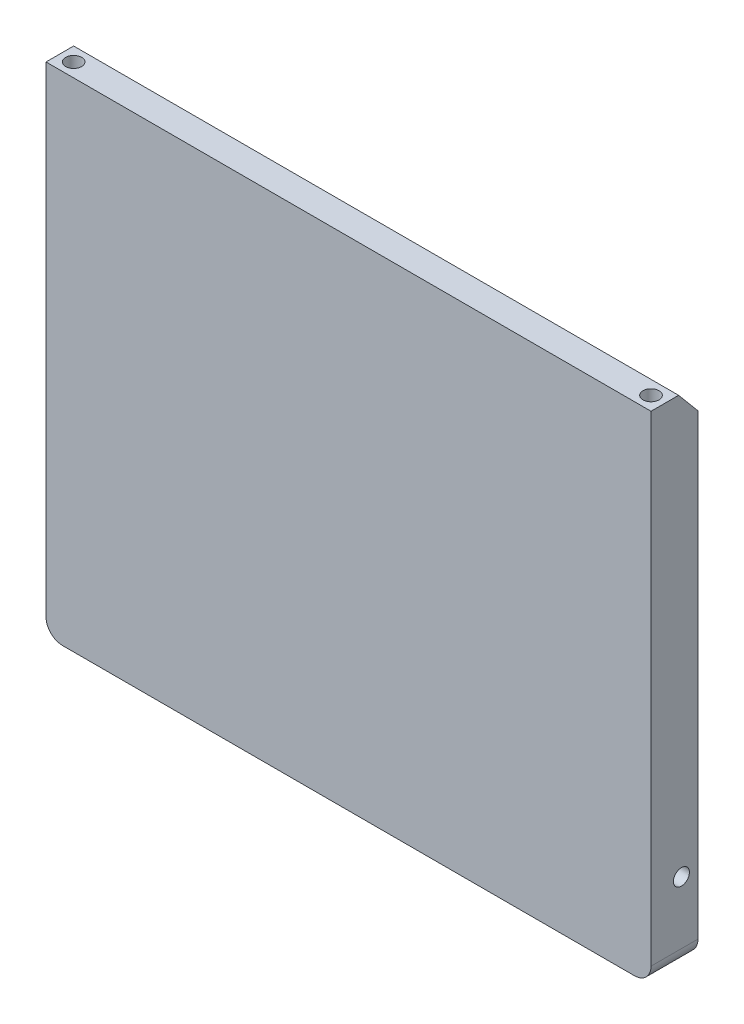
ISO-10303-21;
HEADER;
FILE_DESCRIPTION(('STEP AP214'),'2;1');
FILE_NAME('part.step','',(''),(''),'','','');
FILE_SCHEMA(('AUTOMOTIVE_DESIGN { 1 0 10303 214 1 1 1 1 }'));
ENDSEC;
DATA;
#1=APPLICATION_CONTEXT('core data for automotive mechanical design processes');
#2=APPLICATION_PROTOCOL_DEFINITION('international standard','automotive_design',2000,#1);
#3=PRODUCT_CONTEXT('',#1,'mechanical');
#4=PRODUCT('Part','Part','',(#3));
#5=PRODUCT_RELATED_PRODUCT_CATEGORY('part','',(#4));
#6=PRODUCT_DEFINITION_FORMATION('','',#4);
#7=PRODUCT_DEFINITION_CONTEXT('part definition',#1,'design');
#8=PRODUCT_DEFINITION('design','',#6,#7);
#9=PRODUCT_DEFINITION_SHAPE('','',#8);
#10=(LENGTH_UNIT() NAMED_UNIT(*) SI_UNIT(.MILLI.,.METRE.));
#11=(NAMED_UNIT(*) PLANE_ANGLE_UNIT() SI_UNIT($,.RADIAN.));
#12=(NAMED_UNIT(*) SI_UNIT($,.STERADIAN.) SOLID_ANGLE_UNIT());
#13=UNCERTAINTY_MEASURE_WITH_UNIT(LENGTH_MEASURE(1.E-05),#10,'distance_accuracy_value','');
#14=(GEOMETRIC_REPRESENTATION_CONTEXT(3) GLOBAL_UNCERTAINTY_ASSIGNED_CONTEXT((#13)) GLOBAL_UNIT_ASSIGNED_CONTEXT((#10,
#11,#12)) REPRESENTATION_CONTEXT('',''));
#15=CARTESIAN_POINT('',(0.,0.,0.));
#16=DIRECTION('',(0.,0.,1.));
#17=DIRECTION('',(1.,0.,0.));
#18=AXIS2_PLACEMENT_3D('',#15,#16,#17);
#19=CARTESIAN_POINT('',(-5.30656779661017,-80.8019491525424,5.));
#20=DIRECTION('',(1.,0.,0.));
#21=DIRECTION('',(0.,0.,-1.));
#22=AXIS2_PLACEMENT_3D('',#19,#20,#21);
#23=PLANE('',#22);
#24=CARTESIAN_POINT('',(-5.30656779661018,-66.5519491525424,-0.500000000000002));
#25=DIRECTION('',(1.,0.,0.));
#26=DIRECTION('',(0.,0.,-1.));
#27=AXIS2_PLACEMENT_3D('',#24,#25,#26);
#28=CIRCLE('',#27,1.44999999999999);
#29=CARTESIAN_POINT('',(-5.30656779661018,-66.5519491525424,-1.94999999999999));
#30=VERTEX_POINT('',#29);
#31=EDGE_CURVE('E567',#30,#30,#28,.T.);
#32=ORIENTED_EDGE('',*,*,#31,.T.);
#33=EDGE_LOOP('',(#32));
#34=FACE_BOUND('',#33,.T.);
#35=DIRECTION('',(0.,0.,-1.));
#36=VECTOR('',#35,1.);
#37=CARTESIAN_POINT('',(-5.30656779661017,9.19805084745762,5.));
#38=LINE('',#37,#36);
#39=CARTESIAN_POINT('',(-5.30656779661017,9.19805084745762,5.));
#40=VERTEX_POINT('',#39);
#41=CARTESIAN_POINT('',(-5.30656779661017,9.19805084745762,0.));
#42=VERTEX_POINT('',#41);
#43=EDGE_CURVE('E203',#40,#42,#38,.T.);
#44=ORIENTED_EDGE('',*,*,#43,.T.);
#45=DIRECTION('',(0.,-0.766044443118977,-0.642787609686541));
#46=VECTOR('',#45,1.);
#47=CARTESIAN_POINT('',(-5.30656779661016,5.02691327337787,-3.5));
#48=LINE('',#47,#46);
#49=CARTESIAN_POINT('',(-5.30656779661017,5.02691327337787,-3.5));
#50=VERTEX_POINT('',#49);
#51=EDGE_CURVE('E11',#42,#50,#48,.T.);
#52=ORIENTED_EDGE('',*,*,#51,.T.);
#53=DIRECTION('',(0.,1.,0.));
#54=VECTOR('',#53,1.);
#55=CARTESIAN_POINT('',(-5.30656779661017,-77.8019491525424,-3.5));
#56=LINE('',#55,#54);
#57=CARTESIAN_POINT('',(-5.30656779661017,-77.8019491525424,-3.5));
#58=VERTEX_POINT('',#57);
#59=EDGE_CURVE('E178',#58,#50,#56,.T.);
#60=ORIENTED_EDGE('',*,*,#59,.F.);
#61=DIRECTION('',(0.,0.,-1.));
#62=VECTOR('',#61,1.);
#63=CARTESIAN_POINT('',(-5.30656779661017,-77.8019491525424,5.));
#64=LINE('',#63,#62);
#65=CARTESIAN_POINT('',(-5.30656779661017,-77.8019491525424,5.));
#66=VERTEX_POINT('',#65);
#67=EDGE_CURVE('E218',#58,#66,#64,.F.);
#68=ORIENTED_EDGE('',*,*,#67,.T.);
#69=DIRECTION('',(0.,-1.,0.));
#70=VECTOR('',#69,1.);
#71=CARTESIAN_POINT('',(-5.30656779661017,-80.8019491525424,5.));
#72=LINE('',#71,#70);
#73=EDGE_CURVE('E185',#40,#66,#72,.T.);
#74=ORIENTED_EDGE('',*,*,#73,.F.);
#75=EDGE_LOOP('',(#44,#52,#60,#68,#74));
#76=FACE_BOUND('',#75,.T.);
#77=ADVANCED_FACE('F41',(#34,#76),#23,.F.);
#78=CARTESIAN_POINT('',(-5.30656779661017,-80.8019491525424,5.));
#79=DIRECTION('',(0.,1.,0.));
#80=DIRECTION('',(0.,0.,1.));
#81=AXIS2_PLACEMENT_3D('',#78,#79,#80);
#82=PLANE('',#81);
#83=DIRECTION('',(0.,0.,-1.));
#84=VECTOR('',#83,1.);
#85=CARTESIAN_POINT('',(-2.30656779661017,-80.8019491525424,5.));
#86=LINE('',#85,#84);
#87=CARTESIAN_POINT('',(-2.30656779661017,-80.8019491525424,5.));
#88=VERTEX_POINT('',#87);
#89=CARTESIAN_POINT('',(-2.30656779661017,-80.8019491525424,-3.5));
#90=VERTEX_POINT('',#89);
#91=EDGE_CURVE('E210',#88,#90,#86,.T.);
#92=ORIENTED_EDGE('',*,*,#91,.T.);
#93=DIRECTION('',(-1.,0.,0.));
#94=VECTOR('',#93,1.);
#95=CARTESIAN_POINT('',(101.21343220339,-80.8019491525424,-3.5));
#96=LINE('',#95,#94);
#97=CARTESIAN_POINT('',(101.21343220339,-80.8019491525424,-3.5));
#98=VERTEX_POINT('',#97);
#99=EDGE_CURVE('E172',#98,#90,#96,.T.);
#100=ORIENTED_EDGE('',*,*,#99,.F.);
#101=DIRECTION('',(0.,0.,-1.));
#102=VECTOR('',#101,1.);
#103=CARTESIAN_POINT('',(101.21343220339,-80.8019491525424,5.));
#104=LINE('',#103,#102);
#105=CARTESIAN_POINT('',(101.21343220339,-80.8019491525424,5.));
#106=VERTEX_POINT('',#105);
#107=EDGE_CURVE('E212',#98,#106,#104,.F.);
#108=ORIENTED_EDGE('',*,*,#107,.T.);
#109=DIRECTION('',(1.,0.,0.));
#110=VECTOR('',#109,1.);
#111=CARTESIAN_POINT('',(-5.30656779661017,-80.8019491525424,5.));
#112=LINE('',#111,#110);
#113=EDGE_CURVE('E196',#88,#106,#112,.T.);
#114=ORIENTED_EDGE('',*,*,#113,.F.);
#115=EDGE_LOOP('',(#92,#100,#108,#114));
#116=FACE_BOUND('',#115,.T.);
#117=ADVANCED_FACE('F254',(#116),#82,.F.);
#118=CARTESIAN_POINT('',(104.21343220339,-80.8019491525424,5.));
#119=DIRECTION('',(-1.,0.,0.));
#120=DIRECTION('',(0.,0.,1.));
#121=AXIS2_PLACEMENT_3D('',#118,#119,#120);
#122=PLANE('',#121);
#123=CARTESIAN_POINT('',(104.21343220339,-66.5519491525424,-0.500000000000002));
#124=DIRECTION('',(1.,0.,0.));
#125=DIRECTION('',(0.,0.,-1.));
#126=AXIS2_PLACEMENT_3D('',#123,#124,#125);
#127=CIRCLE('',#126,1.44999999999999);
#128=CARTESIAN_POINT('',(104.21343220339,-66.5519491525424,-1.94999999999999));
#129=VERTEX_POINT('',#128);
#130=EDGE_CURVE('E151',#129,#129,#127,.T.);
#131=ORIENTED_EDGE('',*,*,#130,.F.);
#132=EDGE_LOOP('',(#131));
#133=FACE_BOUND('',#132,.T.);
#134=DIRECTION('',(0.,-1.,0.));
#135=VECTOR('',#134,1.);
#136=CARTESIAN_POINT('',(104.21343220339,9.19805084745762,-3.5));
#137=LINE('',#136,#135);
#138=CARTESIAN_POINT('',(104.21343220339,5.02691327337787,-3.5));
#139=VERTEX_POINT('',#138);
#140=CARTESIAN_POINT('',(104.21343220339,-77.8019491525424,-3.5));
#141=VERTEX_POINT('',#140);
#142=EDGE_CURVE('E164',#139,#141,#137,.T.);
#143=ORIENTED_EDGE('',*,*,#142,.F.);
#144=DIRECTION('',(0.,0.766044443118977,0.642787609686541));
#145=VECTOR('',#144,1.);
#146=CARTESIAN_POINT('',(104.21343220339,5.02691327337787,-3.5));
#147=LINE('',#146,#145);
#148=CARTESIAN_POINT('',(104.21343220339,9.19805084745762,0.));
#149=VERTEX_POINT('',#148);
#150=EDGE_CURVE('E223',#139,#149,#147,.T.);
#151=ORIENTED_EDGE('',*,*,#150,.T.);
#152=DIRECTION('',(0.,0.,-1.));
#153=VECTOR('',#152,1.);
#154=CARTESIAN_POINT('',(104.21343220339,9.19805084745762,5.));
#155=LINE('',#154,#153);
#156=CARTESIAN_POINT('',(104.21343220339,9.19805084745762,5.));
#157=VERTEX_POINT('',#156);
#158=EDGE_CURVE('E205',#157,#149,#155,.T.);
#159=ORIENTED_EDGE('',*,*,#158,.F.);
#160=DIRECTION('',(0.,1.,0.));
#161=VECTOR('',#160,1.);
#162=CARTESIAN_POINT('',(104.21343220339,-80.8019491525424,5.));
#163=LINE('',#162,#161);
#164=CARTESIAN_POINT('',(104.21343220339,-77.8019491525424,5.));
#165=VERTEX_POINT('',#164);
#166=EDGE_CURVE('E199',#165,#157,#163,.T.);
#167=ORIENTED_EDGE('',*,*,#166,.F.);
#168=DIRECTION('',(0.,0.,-1.));
#169=VECTOR('',#168,1.);
#170=CARTESIAN_POINT('',(104.21343220339,-77.8019491525424,5.));
#171=LINE('',#170,#169);
#172=EDGE_CURVE('E207',#165,#141,#171,.T.);
#173=ORIENTED_EDGE('',*,*,#172,.T.);
#174=EDGE_LOOP('',(#143,#151,#159,#167,#173));
#175=FACE_BOUND('',#174,.T.);
#176=ADVANCED_FACE('F227',(#133,#175),#122,.F.);
#177=CARTESIAN_POINT('',(-5.30656779661017,9.19805084745762,5.));
#178=DIRECTION('',(0.,-1.,0.));
#179=DIRECTION('',(0.,0.,-1.));
#180=AXIS2_PLACEMENT_3D('',#177,#178,#179);
#181=PLANE('',#180);
#182=CARTESIAN_POINT('',(101.71343220339,9.19805084745762,2.5));
#183=DIRECTION('',(0.,1.,0.));
#184=DIRECTION('',(0.,0.,1.));
#185=AXIS2_PLACEMENT_3D('',#182,#183,#184);
#186=CIRCLE('',#185,1.45);
#187=CARTESIAN_POINT('',(101.71343220339,9.19805084745762,3.95));
#188=VERTEX_POINT('',#187);
#189=EDGE_CURVE('E186',#188,#188,#186,.T.);
#190=ORIENTED_EDGE('',*,*,#189,.F.);
#191=EDGE_LOOP('',(#190));
#192=FACE_BOUND('',#191,.T.);
#193=CARTESIAN_POINT('',(-2.80656779661017,9.19805084745762,2.5));
#194=DIRECTION('',(0.,1.,0.));
#195=DIRECTION('',(0.,0.,1.));
#196=AXIS2_PLACEMENT_3D('',#193,#194,#195);
#197=CIRCLE('',#196,1.45);
#198=CARTESIAN_POINT('',(-2.80656779661017,9.19805084745762,3.95));
#199=VERTEX_POINT('',#198);
#200=EDGE_CURVE('E189',#199,#199,#197,.T.);
#201=ORIENTED_EDGE('',*,*,#200,.F.);
#202=EDGE_LOOP('',(#201));
#203=FACE_BOUND('',#202,.T.);
#204=ORIENTED_EDGE('',*,*,#158,.T.);
#205=DIRECTION('',(-1.,0.,0.));
#206=VECTOR('',#205,1.);
#207=CARTESIAN_POINT('',(-5.30656779661017,9.19805084745762,0.));
#208=LINE('',#207,#206);
#209=EDGE_CURVE('E50',#149,#42,#208,.T.);
#210=ORIENTED_EDGE('',*,*,#209,.T.);
#211=ORIENTED_EDGE('',*,*,#43,.F.);
#212=DIRECTION('',(-1.,0.,0.));
#213=VECTOR('',#212,1.);
#214=CARTESIAN_POINT('',(-5.30656779661017,9.19805084745762,5.));
#215=LINE('',#214,#213);
#216=EDGE_CURVE('E201',#157,#40,#215,.T.);
#217=ORIENTED_EDGE('',*,*,#216,.F.);
#218=EDGE_LOOP('',(#204,#210,#211,#217));
#219=FACE_BOUND('',#218,.T.);
#220=ADVANCED_FACE('F232',(#192,#203,#219),#181,.F.);
#221=CARTESIAN_POINT('',(0.,0.,5.));
#222=DIRECTION('',(0.,0.,-1.));
#223=DIRECTION('',(-1.,0.,0.));
#224=AXIS2_PLACEMENT_3D('',#221,#222,#223);
#225=PLANE('',#224);
#226=ORIENTED_EDGE('',*,*,#113,.T.);
#227=CARTESIAN_POINT('',(101.21343220339,-77.8019491525424,5.));
#228=DIRECTION('',(0.,0.,-1.));
#229=DIRECTION('',(-1.,0.,0.));
#230=AXIS2_PLACEMENT_3D('',#227,#228,#229);
#231=CIRCLE('',#230,3.);
#232=EDGE_CURVE('E216',#106,#165,#231,.F.);
#233=ORIENTED_EDGE('',*,*,#232,.T.);
#234=ORIENTED_EDGE('',*,*,#166,.T.);
#235=ORIENTED_EDGE('',*,*,#216,.T.);
#236=ORIENTED_EDGE('',*,*,#73,.T.);
#237=CARTESIAN_POINT('',(-2.30656779661017,-77.8019491525424,5.));
#238=DIRECTION('',(0.,0.,-1.));
#239=DIRECTION('',(-1.,0.,0.));
#240=AXIS2_PLACEMENT_3D('',#237,#238,#239);
#241=CIRCLE('',#240,3.);
#242=EDGE_CURVE('E214',#66,#88,#241,.F.);
#243=ORIENTED_EDGE('',*,*,#242,.T.);
#244=EDGE_LOOP('',(#226,#233,#234,#235,#236,#243));
#245=FACE_BOUND('',#244,.T.);
#246=ADVANCED_FACE('F246',(#245),#225,.F.);
#247=CARTESIAN_POINT('',(-2.80656779661017,2.19805084745762,2.5));
#248=DIRECTION('',(0.,1.,0.));
#249=DIRECTION('',(0.,0.,1.));
#250=AXIS2_PLACEMENT_3D('',#247,#248,#249);
#251=CYLINDRICAL_SURFACE('',#250,1.45);
#252=CARTESIAN_POINT('',(-2.80656779661017,2.19805084745762,2.5));
#253=DIRECTION('',(0.,1.,0.));
#254=DIRECTION('',(0.,0.,1.));
#255=AXIS2_PLACEMENT_3D('',#252,#253,#254);
#256=CIRCLE('',#255,1.45);
#257=CARTESIAN_POINT('',(-2.80656779661017,2.19805084745762,3.95));
#258=VERTEX_POINT('',#257);
#259=EDGE_CURVE('E181',#258,#258,#256,.T.);
#260=ORIENTED_EDGE('',*,*,#259,.F.);
#261=EDGE_LOOP('',(#260));
#262=FACE_BOUND('',#261,.T.);
#263=ORIENTED_EDGE('',*,*,#200,.T.);
#264=EDGE_LOOP('',(#263));
#265=FACE_BOUND('',#264,.T.);
#266=ADVANCED_FACE('F289',(#262,#265),#251,.F.);
#267=CARTESIAN_POINT('',(-2.80656779661017,2.19805084745762,2.5));
#268=DIRECTION('',(0.,1.,0.));
#269=DIRECTION('',(0.,0.,1.));
#270=AXIS2_PLACEMENT_3D('',#267,#268,#269);
#271=PLANE('',#270);
#272=ORIENTED_EDGE('',*,*,#259,.T.);
#273=EDGE_LOOP('',(#272));
#274=FACE_BOUND('',#273,.T.);
#275=ADVANCED_FACE('F287',(#274),#271,.T.);
#276=CARTESIAN_POINT('',(101.71343220339,2.19805084745762,2.5));
#277=DIRECTION('',(0.,1.,0.));
#278=DIRECTION('',(0.,0.,1.));
#279=AXIS2_PLACEMENT_3D('',#276,#277,#278);
#280=CYLINDRICAL_SURFACE('',#279,1.45);
#281=CARTESIAN_POINT('',(101.71343220339,2.19805084745762,2.5));
#282=DIRECTION('',(0.,1.,0.));
#283=DIRECTION('',(0.,0.,1.));
#284=AXIS2_PLACEMENT_3D('',#281,#282,#283);
#285=CIRCLE('',#284,1.45);
#286=CARTESIAN_POINT('',(101.71343220339,2.19805084745762,3.95));
#287=VERTEX_POINT('',#286);
#288=EDGE_CURVE('E182',#287,#287,#285,.T.);
#289=ORIENTED_EDGE('',*,*,#288,.F.);
#290=EDGE_LOOP('',(#289));
#291=FACE_BOUND('',#290,.T.);
#292=ORIENTED_EDGE('',*,*,#189,.T.);
#293=EDGE_LOOP('',(#292));
#294=FACE_BOUND('',#293,.T.);
#295=ADVANCED_FACE('F283',(#291,#294),#280,.F.);
#296=CARTESIAN_POINT('',(101.71343220339,2.19805084745762,2.5));
#297=DIRECTION('',(0.,1.,0.));
#298=DIRECTION('',(0.,0.,1.));
#299=AXIS2_PLACEMENT_3D('',#296,#297,#298);
#300=PLANE('',#299);
#301=ORIENTED_EDGE('',*,*,#288,.T.);
#302=EDGE_LOOP('',(#301));
#303=FACE_BOUND('',#302,.T.);
#304=ADVANCED_FACE('F268',(#303),#300,.T.);
#305=CARTESIAN_POINT('',(101.21343220339,-77.8019491525424,5.));
#306=DIRECTION('',(0.,0.,-1.));
#307=DIRECTION('',(-1.,0.,0.));
#308=AXIS2_PLACEMENT_3D('',#305,#306,#307);
#309=CYLINDRICAL_SURFACE('',#308,3.);
#310=ORIENTED_EDGE('',*,*,#232,.F.);
#311=ORIENTED_EDGE('',*,*,#107,.F.);
#312=CARTESIAN_POINT('',(101.21343220339,-77.8019491525424,-3.5));
#313=DIRECTION('',(0.,0.,-1.));
#314=DIRECTION('',(-1.,0.,0.));
#315=AXIS2_PLACEMENT_3D('',#312,#313,#314);
#316=CIRCLE('',#315,3.);
#317=EDGE_CURVE('E169',#141,#98,#316,.T.);
#318=ORIENTED_EDGE('',*,*,#317,.F.);
#319=ORIENTED_EDGE('',*,*,#172,.F.);
#320=EDGE_LOOP('',(#310,#311,#318,#319));
#321=FACE_BOUND('',#320,.T.);
#322=ADVANCED_FACE('F252',(#321),#309,.T.);
#323=CARTESIAN_POINT('',(-2.30656779661017,-77.8019491525424,5.));
#324=DIRECTION('',(0.,0.,-1.));
#325=DIRECTION('',(-1.,0.,0.));
#326=AXIS2_PLACEMENT_3D('',#323,#324,#325);
#327=CYLINDRICAL_SURFACE('',#326,3.);
#328=ORIENTED_EDGE('',*,*,#242,.F.);
#329=ORIENTED_EDGE('',*,*,#67,.F.);
#330=CARTESIAN_POINT('',(-2.30656779661017,-77.8019491525424,-3.5));
#331=DIRECTION('',(0.,0.,-1.));
#332=DIRECTION('',(-1.,0.,0.));
#333=AXIS2_PLACEMENT_3D('',#330,#331,#332);
#334=CIRCLE('',#333,3.);
#335=EDGE_CURVE('E175',#90,#58,#334,.T.);
#336=ORIENTED_EDGE('',*,*,#335,.F.);
#337=ORIENTED_EDGE('',*,*,#91,.F.);
#338=EDGE_LOOP('',(#328,#329,#336,#337));
#339=FACE_BOUND('',#338,.T.);
#340=ADVANCED_FACE('F244',(#339),#327,.T.);
#341=CARTESIAN_POINT('',(101.21343220339,-77.8019491525424,-3.5));
#342=DIRECTION('',(0.,0.,-1.));
#343=DIRECTION('',(-1.,0.,0.));
#344=AXIS2_PLACEMENT_3D('',#341,#342,#343);
#345=PLANE('',#344);
#346=DIRECTION('',(0.,-1.,0.));
#347=VECTOR('',#346,1.);
#348=CARTESIAN_POINT('',(99.5534322033898,3.79805084745763,-3.5));
#349=LINE('',#348,#347);
#350=CARTESIAN_POINT('',(99.5534322033898,3.79805084745763,-3.5));
#351=VERTEX_POINT('',#350);
#352=CARTESIAN_POINT('',(99.5534322033898,-75.4019491525424,-3.5));
#353=VERTEX_POINT('',#352);
#354=EDGE_CURVE('E57',#351,#353,#349,.T.);
#355=ORIENTED_EDGE('',*,*,#354,.F.);
#356=DIRECTION('',(1.,0.,0.));
#357=VECTOR('',#356,1.);
#358=CARTESIAN_POINT('',(99.5534322033898,3.79805084745763,-3.5));
#359=LINE('',#358,#357);
#360=CARTESIAN_POINT('',(-0.646567796610172,3.79805084745764,-3.5));
#361=VERTEX_POINT('',#360);
#362=EDGE_CURVE('E145',#361,#351,#359,.T.);
#363=ORIENTED_EDGE('',*,*,#362,.F.);
#364=DIRECTION('',(0.,1.,0.));
#365=VECTOR('',#364,1.);
#366=CARTESIAN_POINT('',(-0.646567796610172,3.79805084745764,-3.5));
#367=LINE('',#366,#365);
#368=CARTESIAN_POINT('',(-0.646567796610172,-75.4019491525424,-3.5));
#369=VERTEX_POINT('',#368);
#370=EDGE_CURVE('E148',#369,#361,#367,.T.);
#371=ORIENTED_EDGE('',*,*,#370,.F.);
#372=DIRECTION('',(-1.,0.,0.));
#373=VECTOR('',#372,1.);
#374=CARTESIAN_POINT('',(99.5534322033898,-75.4019491525424,-3.5));
#375=LINE('',#374,#373);
#376=EDGE_CURVE('E157',#353,#369,#375,.T.);
#377=ORIENTED_EDGE('',*,*,#376,.F.);
#378=EDGE_LOOP('',(#355,#363,#371,#377));
#379=FACE_BOUND('',#378,.T.);
#380=ORIENTED_EDGE('',*,*,#59,.T.);
#381=DIRECTION('',(1.,0.,0.));
#382=VECTOR('',#381,1.);
#383=CARTESIAN_POINT('',(104.21343220339,5.02691327337787,-3.5));
#384=LINE('',#383,#382);
#385=EDGE_CURVE('E220',#50,#139,#384,.T.);
#386=ORIENTED_EDGE('',*,*,#385,.T.);
#387=ORIENTED_EDGE('',*,*,#142,.T.);
#388=ORIENTED_EDGE('',*,*,#317,.T.);
#389=ORIENTED_EDGE('',*,*,#99,.T.);
#390=ORIENTED_EDGE('',*,*,#335,.T.);
#391=EDGE_LOOP('',(#380,#386,#387,#388,#389,#390));
#392=FACE_BOUND('',#391,.T.);
#393=ADVANCED_FACE('F238',(#379,#392),#345,.T.);
#394=CARTESIAN_POINT('',(101.21343220339,5.02691327337787,-3.5));
#395=DIRECTION('',(0.,0.642787609686541,-0.766044443118977));
#396=DIRECTION('',(-1.,0.,0.));
#397=AXIS2_PLACEMENT_3D('',#394,#395,#396);
#398=PLANE('',#397);
#399=ORIENTED_EDGE('',*,*,#51,.F.);
#400=ORIENTED_EDGE('',*,*,#209,.F.);
#401=ORIENTED_EDGE('',*,*,#150,.F.);
#402=ORIENTED_EDGE('',*,*,#385,.F.);
#403=EDGE_LOOP('',(#399,#400,#401,#402));
#404=FACE_BOUND('',#403,.T.);
#405=ADVANCED_FACE('F44',(#404),#398,.T.);
#406=CARTESIAN_POINT('',(99.5534322033898,3.79805084745763,3.));
#407=DIRECTION('',(1.,0.,0.));
#408=DIRECTION('',(0.,0.,-1.));
#409=AXIS2_PLACEMENT_3D('',#406,#407,#408);
#410=PLANE('',#409);
#411=ORIENTED_EDGE('',*,*,#354,.T.);
#412=DIRECTION('',(0.,0.,-1.));
#413=VECTOR('',#412,1.);
#414=CARTESIAN_POINT('',(99.5534322033898,-75.4019491525424,3.));
#415=LINE('',#414,#413);
#416=CARTESIAN_POINT('',(99.5534322033898,-75.4019491525424,3.));
#417=VERTEX_POINT('',#416);
#418=EDGE_CURVE('E123',#417,#353,#415,.T.);
#419=ORIENTED_EDGE('',*,*,#418,.F.);
#420=DIRECTION('',(0.,-1.,0.));
#421=VECTOR('',#420,1.);
#422=CARTESIAN_POINT('',(99.5534322033898,3.79805084745763,3.));
#423=LINE('',#422,#421);
#424=CARTESIAN_POINT('',(99.5534322033898,3.79805084745763,3.));
#425=VERTEX_POINT('',#424);
#426=EDGE_CURVE('E127',#425,#417,#423,.T.);
#427=ORIENTED_EDGE('',*,*,#426,.F.);
#428=DIRECTION('',(0.,0.,-1.));
#429=VECTOR('',#428,1.);
#430=CARTESIAN_POINT('',(99.5534322033898,3.79805084745763,3.));
#431=LINE('',#430,#429);
#432=EDGE_CURVE('E162',#425,#351,#431,.T.);
#433=ORIENTED_EDGE('',*,*,#432,.T.);
#434=EDGE_LOOP('',(#411,#419,#427,#433));
#435=FACE_BOUND('',#434,.T.);
#436=ADVANCED_FACE('F125',(#435),#410,.F.);
#437=CARTESIAN_POINT('',(99.5534322033898,3.79805084745763,3.));
#438=DIRECTION('',(0.,1.,0.));
#439=DIRECTION('',(-1.,0.,0.));
#440=AXIS2_PLACEMENT_3D('',#437,#438,#439);
#441=PLANE('',#440);
#442=ORIENTED_EDGE('',*,*,#362,.T.);
#443=ORIENTED_EDGE('',*,*,#432,.F.);
#444=DIRECTION('',(1.,0.,0.));
#445=VECTOR('',#444,1.);
#446=CARTESIAN_POINT('',(99.5534322033898,3.79805084745763,3.));
#447=LINE('',#446,#445);
#448=CARTESIAN_POINT('',(-0.646567796610172,3.79805084745764,3.));
#449=VERTEX_POINT('',#448);
#450=EDGE_CURVE('E133',#449,#425,#447,.T.);
#451=ORIENTED_EDGE('',*,*,#450,.F.);
#452=DIRECTION('',(0.,0.,-1.));
#453=VECTOR('',#452,1.);
#454=CARTESIAN_POINT('',(-0.646567796610172,3.79805084745764,3.));
#455=LINE('',#454,#453);
#456=EDGE_CURVE('E165',#449,#361,#455,.T.);
#457=ORIENTED_EDGE('',*,*,#456,.T.);
#458=EDGE_LOOP('',(#442,#443,#451,#457));
#459=FACE_BOUND('',#458,.T.);
#460=ADVANCED_FACE('F356',(#459),#441,.F.);
#461=CARTESIAN_POINT('',(-0.646567796610172,3.79805084745764,3.));
#462=DIRECTION('',(-1.,0.,0.));
#463=DIRECTION('',(0.,0.,1.));
#464=AXIS2_PLACEMENT_3D('',#461,#462,#463);
#465=PLANE('',#464);
#466=ORIENTED_EDGE('',*,*,#370,.T.);
#467=ORIENTED_EDGE('',*,*,#456,.F.);
#468=DIRECTION('',(0.,1.,0.));
#469=VECTOR('',#468,1.);
#470=CARTESIAN_POINT('',(-0.646567796610172,3.79805084745764,3.));
#471=LINE('',#470,#469);
#472=CARTESIAN_POINT('',(-0.646567796610172,-75.4019491525424,3.));
#473=VERTEX_POINT('',#472);
#474=EDGE_CURVE('E141',#473,#449,#471,.T.);
#475=ORIENTED_EDGE('',*,*,#474,.F.);
#476=DIRECTION('',(0.,0.,-1.));
#477=VECTOR('',#476,1.);
#478=CARTESIAN_POINT('',(-0.646567796610172,-75.4019491525424,3.));
#479=LINE('',#478,#477);
#480=EDGE_CURVE('E132',#473,#369,#479,.T.);
#481=ORIENTED_EDGE('',*,*,#480,.T.);
#482=EDGE_LOOP('',(#466,#467,#475,#481));
#483=FACE_BOUND('',#482,.T.);
#484=ADVANCED_FACE('F364',(#483),#465,.F.);
#485=CARTESIAN_POINT('',(99.5534322033898,-75.4019491525424,3.));
#486=DIRECTION('',(0.,-1.,0.));
#487=DIRECTION('',(1.,0.,0.));
#488=AXIS2_PLACEMENT_3D('',#485,#486,#487);
#489=PLANE('',#488);
#490=ORIENTED_EDGE('',*,*,#376,.T.);
#491=ORIENTED_EDGE('',*,*,#480,.F.);
#492=DIRECTION('',(-1.,0.,0.));
#493=VECTOR('',#492,1.);
#494=CARTESIAN_POINT('',(99.5534322033898,-75.4019491525424,3.));
#495=LINE('',#494,#493);
#496=EDGE_CURVE('E136',#417,#473,#495,.T.);
#497=ORIENTED_EDGE('',*,*,#496,.F.);
#498=ORIENTED_EDGE('',*,*,#418,.T.);
#499=EDGE_LOOP('',(#490,#491,#497,#498));
#500=FACE_BOUND('',#499,.T.);
#501=ADVANCED_FACE('F137',(#500),#489,.F.);
#502=CARTESIAN_POINT('',(0.,0.,3.));
#503=DIRECTION('',(0.,0.,-1.));
#504=DIRECTION('',(-1.,0.,0.));
#505=AXIS2_PLACEMENT_3D('',#502,#503,#504);
#506=PLANE('',#505);
#507=ORIENTED_EDGE('',*,*,#426,.T.);
#508=ORIENTED_EDGE('',*,*,#496,.T.);
#509=ORIENTED_EDGE('',*,*,#474,.T.);
#510=ORIENTED_EDGE('',*,*,#450,.T.);
#511=EDGE_LOOP('',(#507,#508,#509,#510));
#512=FACE_BOUND('',#511,.T.);
#513=ADVANCED_FACE('F143',(#512),#506,.T.);
#514=CARTESIAN_POINT('',(101.21343220339,-66.5519491525424,-0.500000000000002));
#515=DIRECTION('',(1.,0.,0.));
#516=DIRECTION('',(0.,0.,-1.));
#517=AXIS2_PLACEMENT_3D('',#514,#515,#516);
#518=CYLINDRICAL_SURFACE('',#517,1.44999999999999);
#519=CARTESIAN_POINT('',(101.21343220339,-66.5519491525424,-0.500000000000002));
#520=DIRECTION('',(1.,0.,0.));
#521=DIRECTION('',(0.,0.,-1.));
#522=AXIS2_PLACEMENT_3D('',#519,#520,#521);
#523=CIRCLE('',#522,1.44999999999999);
#524=CARTESIAN_POINT('',(101.21343220339,-66.5519491525424,-1.94999999999999));
#525=VERTEX_POINT('',#524);
#526=EDGE_CURVE('E158',#525,#525,#523,.T.);
#527=ORIENTED_EDGE('',*,*,#526,.F.);
#528=EDGE_LOOP('',(#527));
#529=FACE_BOUND('',#528,.T.);
#530=ORIENTED_EDGE('',*,*,#130,.T.);
#531=EDGE_LOOP('',(#530));
#532=FACE_BOUND('',#531,.T.);
#533=ADVANCED_FACE('F390',(#529,#532),#518,.F.);
#534=CARTESIAN_POINT('',(101.21343220339,-66.5519491525424,-0.500000000000002));
#535=DIRECTION('',(1.,0.,0.));
#536=DIRECTION('',(0.,0.,-1.));
#537=AXIS2_PLACEMENT_3D('',#534,#535,#536);
#538=PLANE('',#537);
#539=ORIENTED_EDGE('',*,*,#526,.T.);
#540=EDGE_LOOP('',(#539));
#541=FACE_BOUND('',#540,.T.);
#542=ADVANCED_FACE('F400',(#541),#538,.T.);
#543=CARTESIAN_POINT('',(-2.30656779661018,-66.5519491525424,-0.500000000000002));
#544=DIRECTION('',(-1.,0.,0.));
#545=DIRECTION('',(0.,0.,1.));
#546=AXIS2_PLACEMENT_3D('',#543,#544,#545);
#547=CYLINDRICAL_SURFACE('',#546,1.44999999999999);
#548=CARTESIAN_POINT('',(-2.30656779661018,-66.5519491525424,-0.500000000000002));
#549=DIRECTION('',(1.,0.,0.));
#550=DIRECTION('',(0.,0.,-1.));
#551=AXIS2_PLACEMENT_3D('',#548,#549,#550);
#552=CIRCLE('',#551,1.44999999999999);
#553=CARTESIAN_POINT('',(-2.30656779661018,-66.5519491525424,-1.94999999999999));
#554=VERTEX_POINT('',#553);
#555=EDGE_CURVE('E566',#554,#554,#552,.T.);
#556=ORIENTED_EDGE('',*,*,#555,.T.);
#557=EDGE_LOOP('',(#556));
#558=FACE_BOUND('',#557,.T.);
#559=ORIENTED_EDGE('',*,*,#31,.F.);
#560=EDGE_LOOP('',(#559));
#561=FACE_BOUND('',#560,.T.);
#562=ADVANCED_FACE('F410',(#558,#561),#547,.F.);
#563=CARTESIAN_POINT('',(-2.30656779661018,-66.5519491525424,-0.500000000000002));
#564=DIRECTION('',(-1.,0.,0.));
#565=DIRECTION('',(0.,0.,-1.));
#566=AXIS2_PLACEMENT_3D('',#563,#564,#565);
#567=PLANE('',#566);
#568=ORIENTED_EDGE('',*,*,#555,.F.);
#569=EDGE_LOOP('',(#568));
#570=FACE_BOUND('',#569,.T.);
#571=ADVANCED_FACE('F421',(#570),#567,.T.);
#572=CLOSED_SHELL('',(#77,#117,#176,#220,#246,#266,#275,#295,#304,#322,#340,#393,#405,#436,#460,
#484,#501,#513,#533,#542,#562,#571));
#573=MANIFOLD_SOLID_BREP('B2',#572);
#574=ADVANCED_BREP_SHAPE_REPRESENTATION('',(#18,#573),#14);
#575=SHAPE_DEFINITION_REPRESENTATION(#9,#574);
ENDSEC;
END-ISO-10303-21;
